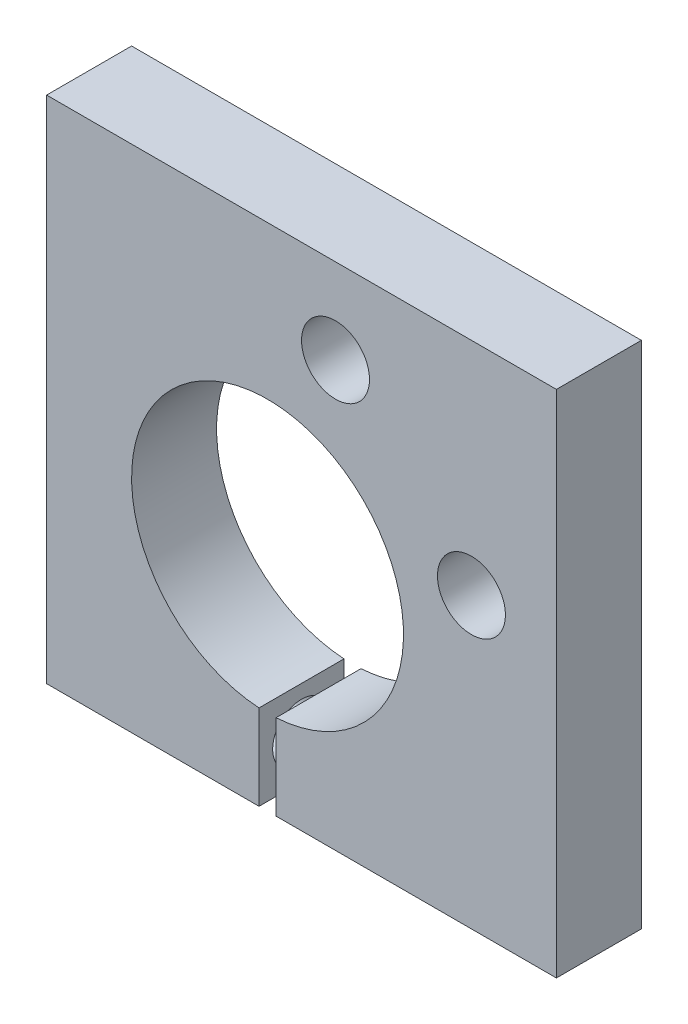
ISO-10303-21;
HEADER;
FILE_DESCRIPTION(('STEP AP214'),'2;1');
FILE_NAME('part.step','',(''),(''),'','','');
FILE_SCHEMA(('AUTOMOTIVE_DESIGN { 1 0 10303 214 1 1 1 1 }'));
ENDSEC;
DATA;
#1=APPLICATION_CONTEXT('core data for automotive mechanical design processes');
#2=APPLICATION_PROTOCOL_DEFINITION('international standard','automotive_design',2000,#1);
#3=PRODUCT_CONTEXT('',#1,'mechanical');
#4=PRODUCT('Part','Part','',(#3));
#5=PRODUCT_RELATED_PRODUCT_CATEGORY('part','',(#4));
#6=PRODUCT_DEFINITION_FORMATION('','',#4);
#7=PRODUCT_DEFINITION_CONTEXT('part definition',#1,'design');
#8=PRODUCT_DEFINITION('design','',#6,#7);
#9=PRODUCT_DEFINITION_SHAPE('','',#8);
#10=(LENGTH_UNIT() NAMED_UNIT(*) SI_UNIT(.MILLI.,.METRE.));
#11=(NAMED_UNIT(*) PLANE_ANGLE_UNIT() SI_UNIT($,.RADIAN.));
#12=(NAMED_UNIT(*) SI_UNIT($,.STERADIAN.) SOLID_ANGLE_UNIT());
#13=UNCERTAINTY_MEASURE_WITH_UNIT(LENGTH_MEASURE(1.E-05),#10,'distance_accuracy_value','');
#14=(GEOMETRIC_REPRESENTATION_CONTEXT(3) GLOBAL_UNCERTAINTY_ASSIGNED_CONTEXT((#13)) GLOBAL_UNIT_ASSIGNED_CONTEXT((#10,
#11,#12)) REPRESENTATION_CONTEXT('',''));
#15=CARTESIAN_POINT('',(0.,0.,0.));
#16=DIRECTION('',(0.,0.,1.));
#17=DIRECTION('',(1.,0.,0.));
#18=AXIS2_PLACEMENT_3D('',#15,#16,#17);
#19=CARTESIAN_POINT('',(13.,13.,5.));
#20=DIRECTION('',(0.,0.,-1.));
#21=DIRECTION('',(-1.,0.,0.));
#22=AXIS2_PLACEMENT_3D('',#19,#20,#21);
#23=CYLINDRICAL_SURFACE('',#22,8.);
#24=CARTESIAN_POINT('',(13.,13.,0.));
#25=DIRECTION('',(0.,0.,1.));
#26=DIRECTION('',(1.,0.,0.));
#27=AXIS2_PLACEMENT_3D('',#24,#25,#26);
#28=CIRCLE('',#27,8.);
#29=CARTESIAN_POINT('',(13.5,5.01564028866434,0.));
#30=VERTEX_POINT('',#29);
#31=CARTESIAN_POINT('',(12.5,5.01564028866434,0.));
#32=VERTEX_POINT('',#31);
#33=EDGE_CURVE('E144',#30,#32,#28,.T.);
#34=ORIENTED_EDGE('',*,*,#33,.F.);
#35=DIRECTION('',(0.,0.,-1.));
#36=VECTOR('',#35,1.);
#37=CARTESIAN_POINT('',(13.5,5.01564028866434,5.));
#38=LINE('',#37,#36);
#39=CARTESIAN_POINT('',(13.5,5.01564028866434,5.));
#40=VERTEX_POINT('',#39);
#41=EDGE_CURVE('E11',#40,#30,#38,.T.);
#42=ORIENTED_EDGE('',*,*,#41,.F.);
#43=CARTESIAN_POINT('',(13.,13.,5.));
#44=DIRECTION('',(0.,0.,1.));
#45=DIRECTION('',(1.,0.,0.));
#46=AXIS2_PLACEMENT_3D('',#43,#44,#45);
#47=CIRCLE('',#46,8.);
#48=CARTESIAN_POINT('',(12.5,5.01564028866434,5.));
#49=VERTEX_POINT('',#48);
#50=EDGE_CURVE('E237',#40,#49,#47,.T.);
#51=ORIENTED_EDGE('',*,*,#50,.T.);
#52=DIRECTION('',(0.,0.,-1.));
#53=VECTOR('',#52,1.);
#54=CARTESIAN_POINT('',(12.5,5.01564028866434,5.));
#55=LINE('',#54,#53);
#56=EDGE_CURVE('E90',#49,#32,#55,.T.);
#57=ORIENTED_EDGE('',*,*,#56,.T.);
#58=EDGE_LOOP('',(#34,#42,#51,#57));
#59=FACE_BOUND('',#58,.T.);
#60=ADVANCED_FACE('F37',(#59),#23,.F.);
#61=CARTESIAN_POINT('',(13.5,0.,5.));
#62=DIRECTION('',(-1.,0.,0.));
#63=DIRECTION('',(0.,0.,1.));
#64=AXIS2_PLACEMENT_3D('',#61,#62,#63);
#65=PLANE('',#64);
#66=CARTESIAN_POINT('',(13.5,2.50782014433218,2.5));
#67=DIRECTION('',(-1.,0.,0.));
#68=DIRECTION('',(0.,0.,1.));
#69=AXIS2_PLACEMENT_3D('',#66,#67,#68);
#70=CIRCLE('',#69,1.25);
#71=CARTESIAN_POINT('',(13.5,2.50782014433218,3.75));
#72=VERTEX_POINT('',#71);
#73=EDGE_CURVE('E252',#72,#72,#70,.T.);
#74=ORIENTED_EDGE('',*,*,#73,.F.);
#75=EDGE_LOOP('',(#74));
#76=FACE_BOUND('',#75,.T.);
#77=DIRECTION('',(0.,1.,0.));
#78=VECTOR('',#77,1.);
#79=CARTESIAN_POINT('',(13.5,0.,0.));
#80=LINE('',#79,#78);
#81=CARTESIAN_POINT('',(13.5,0.,0.));
#82=VERTEX_POINT('',#81);
#83=EDGE_CURVE('E146',#82,#30,#80,.T.);
#84=ORIENTED_EDGE('',*,*,#83,.F.);
#85=DIRECTION('',(0.,0.,-1.));
#86=VECTOR('',#85,1.);
#87=CARTESIAN_POINT('',(13.5,0.,5.));
#88=LINE('',#87,#86);
#89=CARTESIAN_POINT('',(13.5,0.,5.));
#90=VERTEX_POINT('',#89);
#91=EDGE_CURVE('E46',#90,#82,#88,.T.);
#92=ORIENTED_EDGE('',*,*,#91,.F.);
#93=DIRECTION('',(0.,1.,0.));
#94=VECTOR('',#93,1.);
#95=CARTESIAN_POINT('',(13.5,0.,5.));
#96=LINE('',#95,#94);
#97=EDGE_CURVE('E181',#90,#40,#96,.T.);
#98=ORIENTED_EDGE('',*,*,#97,.T.);
#99=ORIENTED_EDGE('',*,*,#41,.T.);
#100=EDGE_LOOP('',(#84,#92,#98,#99));
#101=FACE_BOUND('',#100,.T.);
#102=ADVANCED_FACE('F180',(#76,#101),#65,.T.);
#103=CARTESIAN_POINT('',(0.,0.,5.));
#104=DIRECTION('',(0.,1.,0.));
#105=DIRECTION('',(0.,0.,1.));
#106=AXIS2_PLACEMENT_3D('',#103,#104,#105);
#107=PLANE('',#106);
#108=DIRECTION('',(1.,0.,0.));
#109=VECTOR('',#108,1.);
#110=CARTESIAN_POINT('',(0.,0.,0.));
#111=LINE('',#110,#109);
#112=CARTESIAN_POINT('',(30.,0.,0.));
#113=VERTEX_POINT('',#112);
#114=EDGE_CURVE('E149',#82,#113,#111,.T.);
#115=ORIENTED_EDGE('',*,*,#114,.T.);
#116=DIRECTION('',(0.,0.,-1.));
#117=VECTOR('',#116,1.);
#118=CARTESIAN_POINT('',(30.,0.,5.));
#119=LINE('',#118,#117);
#120=CARTESIAN_POINT('',(30.,0.,5.));
#121=VERTEX_POINT('',#120);
#122=EDGE_CURVE('E167',#121,#113,#119,.T.);
#123=ORIENTED_EDGE('',*,*,#122,.F.);
#124=DIRECTION('',(1.,0.,0.));
#125=VECTOR('',#124,1.);
#126=CARTESIAN_POINT('',(0.,0.,5.));
#127=LINE('',#126,#125);
#128=EDGE_CURVE('E126',#90,#121,#127,.T.);
#129=ORIENTED_EDGE('',*,*,#128,.F.);
#130=ORIENTED_EDGE('',*,*,#91,.T.);
#131=EDGE_LOOP('',(#115,#123,#129,#130));
#132=FACE_BOUND('',#131,.T.);
#133=ADVANCED_FACE('F172',(#132),#107,.F.);
#134=CARTESIAN_POINT('',(30.,0.,5.));
#135=DIRECTION('',(-1.,0.,0.));
#136=DIRECTION('',(0.,0.,1.));
#137=AXIS2_PLACEMENT_3D('',#134,#135,#136);
#138=PLANE('',#137);
#139=DIRECTION('',(0.,1.,0.));
#140=VECTOR('',#139,1.);
#141=CARTESIAN_POINT('',(30.,0.,0.));
#142=LINE('',#141,#140);
#143=CARTESIAN_POINT('',(30.,30.,0.));
#144=VERTEX_POINT('',#143);
#145=EDGE_CURVE('E152',#113,#144,#142,.T.);
#146=ORIENTED_EDGE('',*,*,#145,.T.);
#147=DIRECTION('',(0.,0.,-1.));
#148=VECTOR('',#147,1.);
#149=CARTESIAN_POINT('',(30.,30.,5.));
#150=LINE('',#149,#148);
#151=CARTESIAN_POINT('',(30.,30.,5.));
#152=VERTEX_POINT('',#151);
#153=EDGE_CURVE('E165',#152,#144,#150,.T.);
#154=ORIENTED_EDGE('',*,*,#153,.F.);
#155=DIRECTION('',(0.,1.,0.));
#156=VECTOR('',#155,1.);
#157=CARTESIAN_POINT('',(30.,0.,5.));
#158=LINE('',#157,#156);
#159=EDGE_CURVE('E132',#121,#152,#158,.T.);
#160=ORIENTED_EDGE('',*,*,#159,.F.);
#161=ORIENTED_EDGE('',*,*,#122,.T.);
#162=EDGE_LOOP('',(#146,#154,#160,#161));
#163=FACE_BOUND('',#162,.T.);
#164=ADVANCED_FACE('F228',(#163),#138,.F.);
#165=CARTESIAN_POINT('',(0.,30.,5.));
#166=DIRECTION('',(0.,1.,0.));
#167=DIRECTION('',(0.,0.,1.));
#168=AXIS2_PLACEMENT_3D('',#165,#166,#167);
#169=PLANE('',#168);
#170=DIRECTION('',(1.,0.,0.));
#171=VECTOR('',#170,1.);
#172=CARTESIAN_POINT('',(0.,30.,0.));
#173=LINE('',#172,#171);
#174=CARTESIAN_POINT('',(0.,30.,0.));
#175=VERTEX_POINT('',#174);
#176=EDGE_CURVE('E156',#175,#144,#173,.T.);
#177=ORIENTED_EDGE('',*,*,#176,.F.);
#178=DIRECTION('',(0.,0.,-1.));
#179=VECTOR('',#178,1.);
#180=CARTESIAN_POINT('',(0.,30.,5.));
#181=LINE('',#180,#179);
#182=CARTESIAN_POINT('',(0.,30.,5.));
#183=VERTEX_POINT('',#182);
#184=EDGE_CURVE('E119',#183,#175,#181,.T.);
#185=ORIENTED_EDGE('',*,*,#184,.F.);
#186=DIRECTION('',(1.,0.,0.));
#187=VECTOR('',#186,1.);
#188=CARTESIAN_POINT('',(0.,30.,5.));
#189=LINE('',#188,#187);
#190=EDGE_CURVE('E130',#183,#152,#189,.T.);
#191=ORIENTED_EDGE('',*,*,#190,.T.);
#192=ORIENTED_EDGE('',*,*,#153,.T.);
#193=EDGE_LOOP('',(#177,#185,#191,#192));
#194=FACE_BOUND('',#193,.T.);
#195=ADVANCED_FACE('F225',(#194),#169,.T.);
#196=CARTESIAN_POINT('',(0.,0.,5.));
#197=DIRECTION('',(-1.,0.,0.));
#198=DIRECTION('',(0.,0.,1.));
#199=AXIS2_PLACEMENT_3D('',#196,#197,#198);
#200=PLANE('',#199);
#201=CARTESIAN_POINT('',(0.,2.50782014433217,2.5));
#202=DIRECTION('',(-1.,0.,0.));
#203=DIRECTION('',(0.,0.,1.));
#204=AXIS2_PLACEMENT_3D('',#201,#202,#203);
#205=CIRCLE('',#204,1.69999999999999);
#206=CARTESIAN_POINT('',(0.,2.50782014433217,4.19999999999999));
#207=VERTEX_POINT('',#206);
#208=EDGE_CURVE('E246',#207,#207,#205,.T.);
#209=ORIENTED_EDGE('',*,*,#208,.F.);
#210=EDGE_LOOP('',(#209));
#211=FACE_BOUND('',#210,.T.);
#212=DIRECTION('',(0.,1.,0.));
#213=VECTOR('',#212,1.);
#214=CARTESIAN_POINT('',(0.,0.,0.));
#215=LINE('',#214,#213);
#216=CARTESIAN_POINT('',(0.,0.,0.));
#217=VERTEX_POINT('',#216);
#218=EDGE_CURVE('E116',#217,#175,#215,.T.);
#219=ORIENTED_EDGE('',*,*,#218,.F.);
#220=DIRECTION('',(0.,0.,-1.));
#221=VECTOR('',#220,1.);
#222=CARTESIAN_POINT('',(0.,0.,5.));
#223=LINE('',#222,#221);
#224=CARTESIAN_POINT('',(0.,0.,5.));
#225=VERTEX_POINT('',#224);
#226=EDGE_CURVE('E110',#225,#217,#223,.T.);
#227=ORIENTED_EDGE('',*,*,#226,.F.);
#228=DIRECTION('',(0.,1.,0.));
#229=VECTOR('',#228,1.);
#230=CARTESIAN_POINT('',(0.,0.,5.));
#231=LINE('',#230,#229);
#232=EDGE_CURVE('E114',#225,#183,#231,.T.);
#233=ORIENTED_EDGE('',*,*,#232,.T.);
#234=ORIENTED_EDGE('',*,*,#184,.T.);
#235=EDGE_LOOP('',(#219,#227,#233,#234));
#236=FACE_BOUND('',#235,.T.);
#237=ADVANCED_FACE('F112',(#211,#236),#200,.T.);
#238=CARTESIAN_POINT('',(12.5,0.,0.));
#239=VERTEX_POINT('',#238);
#240=EDGE_CURVE('E153',#217,#239,#111,.T.);
#241=ORIENTED_EDGE('',*,*,#240,.T.);
#242=DIRECTION('',(0.,0.,-1.));
#243=VECTOR('',#242,1.);
#244=CARTESIAN_POINT('',(12.5,0.,5.));
#245=LINE('',#244,#243);
#246=CARTESIAN_POINT('',(12.5,0.,5.));
#247=VERTEX_POINT('',#246);
#248=EDGE_CURVE('E120',#247,#239,#245,.T.);
#249=ORIENTED_EDGE('',*,*,#248,.F.);
#250=EDGE_CURVE('E123',#225,#247,#127,.T.);
#251=ORIENTED_EDGE('',*,*,#250,.F.);
#252=ORIENTED_EDGE('',*,*,#226,.T.);
#253=EDGE_LOOP('',(#241,#249,#251,#252));
#254=FACE_BOUND('',#253,.T.);
#255=ADVANCED_FACE('F124',(#254),#107,.F.);
#256=CARTESIAN_POINT('',(17.,25.,5.));
#257=DIRECTION('',(0.,0.,-1.));
#258=DIRECTION('',(-1.,0.,0.));
#259=AXIS2_PLACEMENT_3D('',#256,#257,#258);
#260=CYLINDRICAL_SURFACE('',#259,2.00000000000001);
#261=CARTESIAN_POINT('',(17.,25.,5.));
#262=DIRECTION('',(0.,0.,1.));
#263=DIRECTION('',(1.,0.,0.));
#264=AXIS2_PLACEMENT_3D('',#261,#262,#263);
#265=CIRCLE('',#264,2.00000000000001);
#266=CARTESIAN_POINT('',(19.,25.,5.));
#267=VERTEX_POINT('',#266);
#268=EDGE_CURVE('E203',#267,#267,#265,.T.);
#269=ORIENTED_EDGE('',*,*,#268,.T.);
#270=EDGE_LOOP('',(#269));
#271=FACE_BOUND('',#270,.T.);
#272=CARTESIAN_POINT('',(17.,25.,0.));
#273=DIRECTION('',(0.,0.,1.));
#274=DIRECTION('',(1.,0.,0.));
#275=AXIS2_PLACEMENT_3D('',#272,#273,#274);
#276=CIRCLE('',#275,2.00000000000001);
#277=CARTESIAN_POINT('',(19.,25.,0.));
#278=VERTEX_POINT('',#277);
#279=EDGE_CURVE('E140',#278,#278,#276,.T.);
#280=ORIENTED_EDGE('',*,*,#279,.F.);
#281=EDGE_LOOP('',(#280));
#282=FACE_BOUND('',#281,.T.);
#283=ADVANCED_FACE('F190',(#271,#282),#260,.F.);
#284=CARTESIAN_POINT('',(25.,17.,5.));
#285=DIRECTION('',(0.,0.,-1.));
#286=DIRECTION('',(-1.,0.,0.));
#287=AXIS2_PLACEMENT_3D('',#284,#285,#286);
#288=CYLINDRICAL_SURFACE('',#287,2.00000000000001);
#289=CARTESIAN_POINT('',(25.,17.,5.));
#290=DIRECTION('',(0.,0.,1.));
#291=DIRECTION('',(1.,0.,0.));
#292=AXIS2_PLACEMENT_3D('',#289,#290,#291);
#293=CIRCLE('',#292,2.00000000000001);
#294=CARTESIAN_POINT('',(27.,17.,5.));
#295=VERTEX_POINT('',#294);
#296=EDGE_CURVE('E161',#295,#295,#293,.T.);
#297=ORIENTED_EDGE('',*,*,#296,.T.);
#298=EDGE_LOOP('',(#297));
#299=FACE_BOUND('',#298,.T.);
#300=CARTESIAN_POINT('',(25.,17.,0.));
#301=DIRECTION('',(0.,0.,1.));
#302=DIRECTION('',(1.,0.,0.));
#303=AXIS2_PLACEMENT_3D('',#300,#301,#302);
#304=CIRCLE('',#303,2.00000000000001);
#305=CARTESIAN_POINT('',(27.,17.,0.));
#306=VERTEX_POINT('',#305);
#307=EDGE_CURVE('E137',#306,#306,#304,.T.);
#308=ORIENTED_EDGE('',*,*,#307,.F.);
#309=EDGE_LOOP('',(#308));
#310=FACE_BOUND('',#309,.T.);
#311=ADVANCED_FACE('F39',(#299,#310),#288,.F.);
#312=CARTESIAN_POINT('',(12.5,0.,5.));
#313=DIRECTION('',(-1.,0.,0.));
#314=DIRECTION('',(0.,-1.,0.));
#315=AXIS2_PLACEMENT_3D('',#312,#313,#314);
#316=PLANE('',#315);
#317=CARTESIAN_POINT('',(12.5,2.50782014433217,2.5));
#318=DIRECTION('',(-1.,0.,0.));
#319=DIRECTION('',(0.,-1.,0.));
#320=AXIS2_PLACEMENT_3D('',#317,#318,#319);
#321=CIRCLE('',#320,1.69999999999999);
#322=CARTESIAN_POINT('',(12.5,0.80782014433218,2.5));
#323=VERTEX_POINT('',#322);
#324=EDGE_CURVE('E141',#323,#323,#321,.T.);
#325=ORIENTED_EDGE('',*,*,#324,.T.);
#326=EDGE_LOOP('',(#325));
#327=FACE_BOUND('',#326,.T.);
#328=DIRECTION('',(0.,1.,0.));
#329=VECTOR('',#328,1.);
#330=CARTESIAN_POINT('',(12.5,0.,0.));
#331=LINE('',#330,#329);
#332=EDGE_CURVE('E83',#239,#32,#331,.T.);
#333=ORIENTED_EDGE('',*,*,#332,.T.);
#334=ORIENTED_EDGE('',*,*,#56,.F.);
#335=DIRECTION('',(0.,1.,0.));
#336=VECTOR('',#335,1.);
#337=CARTESIAN_POINT('',(12.5,0.,5.));
#338=LINE('',#337,#336);
#339=EDGE_CURVE('E54',#247,#49,#338,.T.);
#340=ORIENTED_EDGE('',*,*,#339,.F.);
#341=ORIENTED_EDGE('',*,*,#248,.T.);
#342=EDGE_LOOP('',(#333,#334,#340,#341));
#343=FACE_BOUND('',#342,.T.);
#344=ADVANCED_FACE('F197',(#327,#343),#316,.F.);
#345=CARTESIAN_POINT('',(0.,0.,5.));
#346=DIRECTION('',(0.,0.,1.));
#347=DIRECTION('',(1.,0.,0.));
#348=AXIS2_PLACEMENT_3D('',#345,#346,#347);
#349=PLANE('',#348);
#350=ORIENTED_EDGE('',*,*,#296,.F.);
#351=EDGE_LOOP('',(#350));
#352=FACE_BOUND('',#351,.T.);
#353=ORIENTED_EDGE('',*,*,#268,.F.);
#354=EDGE_LOOP('',(#353));
#355=FACE_BOUND('',#354,.T.);
#356=ORIENTED_EDGE('',*,*,#50,.F.);
#357=ORIENTED_EDGE('',*,*,#97,.F.);
#358=ORIENTED_EDGE('',*,*,#128,.T.);
#359=ORIENTED_EDGE('',*,*,#159,.T.);
#360=ORIENTED_EDGE('',*,*,#190,.F.);
#361=ORIENTED_EDGE('',*,*,#232,.F.);
#362=ORIENTED_EDGE('',*,*,#250,.T.);
#363=ORIENTED_EDGE('',*,*,#339,.T.);
#364=EDGE_LOOP('',(#356,#357,#358,#359,#360,#361,#362,#363));
#365=FACE_BOUND('',#364,.T.);
#366=ADVANCED_FACE('F128',(#352,#355,#365),#349,.T.);
#367=CARTESIAN_POINT('',(0.,0.,0.));
#368=DIRECTION('',(0.,0.,1.));
#369=DIRECTION('',(1.,0.,0.));
#370=AXIS2_PLACEMENT_3D('',#367,#368,#369);
#371=PLANE('',#370);
#372=ORIENTED_EDGE('',*,*,#307,.T.);
#373=EDGE_LOOP('',(#372));
#374=FACE_BOUND('',#373,.T.);
#375=ORIENTED_EDGE('',*,*,#279,.T.);
#376=EDGE_LOOP('',(#375));
#377=FACE_BOUND('',#376,.T.);
#378=ORIENTED_EDGE('',*,*,#33,.T.);
#379=ORIENTED_EDGE('',*,*,#332,.F.);
#380=ORIENTED_EDGE('',*,*,#240,.F.);
#381=ORIENTED_EDGE('',*,*,#218,.T.);
#382=ORIENTED_EDGE('',*,*,#176,.T.);
#383=ORIENTED_EDGE('',*,*,#145,.F.);
#384=ORIENTED_EDGE('',*,*,#114,.F.);
#385=ORIENTED_EDGE('',*,*,#83,.T.);
#386=EDGE_LOOP('',(#378,#379,#380,#381,#382,#383,#384,#385));
#387=FACE_BOUND('',#386,.T.);
#388=ADVANCED_FACE('F179',(#374,#377,#387),#371,.F.);
#389=CARTESIAN_POINT('',(0.,2.50782014433217,2.5));
#390=DIRECTION('',(-1.,0.,0.));
#391=DIRECTION('',(0.,0.,1.));
#392=AXIS2_PLACEMENT_3D('',#389,#390,#391);
#393=CYLINDRICAL_SURFACE('',#392,1.69999999999999);
#394=ORIENTED_EDGE('',*,*,#324,.F.);
#395=EDGE_LOOP('',(#394));
#396=FACE_BOUND('',#395,.T.);
#397=ORIENTED_EDGE('',*,*,#208,.T.);
#398=EDGE_LOOP('',(#397));
#399=FACE_BOUND('',#398,.T.);
#400=ADVANCED_FACE('F207',(#396,#399),#393,.F.);
#401=CARTESIAN_POINT('',(18.,2.50782014433218,2.5));
#402=DIRECTION('',(-1.,0.,0.));
#403=DIRECTION('',(0.,0.,1.));
#404=AXIS2_PLACEMENT_3D('',#401,#402,#403);
#405=CONICAL_SURFACE('',#404,1.25,1.02974425867665);
#406=CARTESIAN_POINT('',(18.7510757737845,2.50782014433217,2.5));
#407=VERTEX_POINT('',#406);
#408=VERTEX_LOOP('',#407);
#409=FACE_BOUND('',#408,.T.);
#410=CARTESIAN_POINT('',(18.,2.50782014433218,2.5));
#411=DIRECTION('',(-1.,0.,0.));
#412=DIRECTION('',(0.,0.,1.));
#413=AXIS2_PLACEMENT_3D('',#410,#411,#412);
#414=CIRCLE('',#413,1.25);
#415=CARTESIAN_POINT('',(18.,2.50782014433218,3.75));
#416=VERTEX_POINT('',#415);
#417=EDGE_CURVE('E249',#416,#416,#414,.T.);
#418=ORIENTED_EDGE('',*,*,#417,.T.);
#419=EDGE_LOOP('',(#418));
#420=FACE_BOUND('',#419,.T.);
#421=ADVANCED_FACE('F214',(#409,#420),#405,.F.);
#422=CARTESIAN_POINT('',(13.5,2.50782014433218,2.5));
#423=DIRECTION('',(-1.,0.,0.));
#424=DIRECTION('',(0.,0.,1.));
#425=AXIS2_PLACEMENT_3D('',#422,#423,#424);
#426=CYLINDRICAL_SURFACE('',#425,1.25);
#427=ORIENTED_EDGE('',*,*,#417,.F.);
#428=EDGE_LOOP('',(#427));
#429=FACE_BOUND('',#428,.T.);
#430=ORIENTED_EDGE('',*,*,#73,.T.);
#431=EDGE_LOOP('',(#430));
#432=FACE_BOUND('',#431,.T.);
#433=ADVANCED_FACE('F256',(#429,#432),#426,.F.);
#434=CLOSED_SHELL('',(#60,#102,#133,#164,#195,#237,#255,#283,#311,#344,#366,#388,#400,#421,#433));
#435=MANIFOLD_SOLID_BREP('B2',#434);
#436=ADVANCED_BREP_SHAPE_REPRESENTATION('',(#18,#435),#14);
#437=SHAPE_DEFINITION_REPRESENTATION(#9,#436);
ENDSEC;
END-ISO-10303-21;
